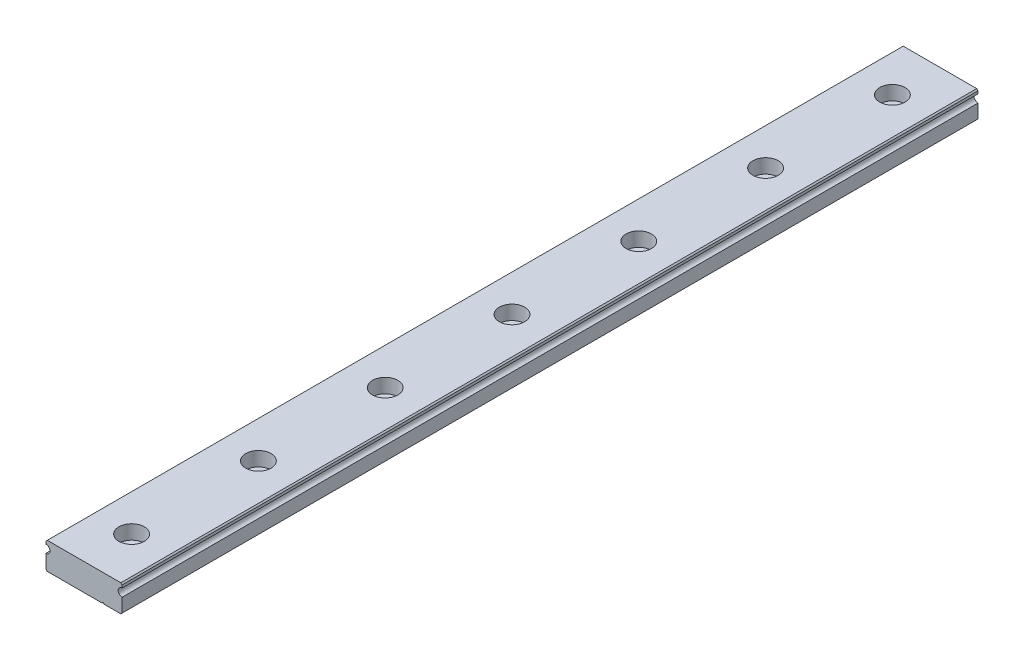
ISO-10303-21;
HEADER;
FILE_DESCRIPTION(('STEP AP214'),'2;1');
FILE_NAME('part.step','',(''),(''),'','','');
FILE_SCHEMA(('AUTOMOTIVE_DESIGN { 1 0 10303 214 1 1 1 1 }'));
ENDSEC;
DATA;
#1=APPLICATION_CONTEXT('core data for automotive mechanical design processes');
#2=APPLICATION_PROTOCOL_DEFINITION('international standard','automotive_design',2000,#1);
#3=PRODUCT_CONTEXT('',#1,'mechanical');
#4=PRODUCT('Part','Part','',(#3));
#5=PRODUCT_RELATED_PRODUCT_CATEGORY('part','',(#4));
#6=PRODUCT_DEFINITION_FORMATION('','',#4);
#7=PRODUCT_DEFINITION_CONTEXT('part definition',#1,'design');
#8=PRODUCT_DEFINITION('design','',#6,#7);
#9=PRODUCT_DEFINITION_SHAPE('','',#8);
#10=(LENGTH_UNIT() NAMED_UNIT(*) SI_UNIT(.MILLI.,.METRE.));
#11=(NAMED_UNIT(*) PLANE_ANGLE_UNIT() SI_UNIT($,.RADIAN.));
#12=(NAMED_UNIT(*) SI_UNIT($,.STERADIAN.) SOLID_ANGLE_UNIT());
#13=UNCERTAINTY_MEASURE_WITH_UNIT(LENGTH_MEASURE(1.E-05),#10,'distance_accuracy_value','');
#14=(GEOMETRIC_REPRESENTATION_CONTEXT(3) GLOBAL_UNCERTAINTY_ASSIGNED_CONTEXT((#13)) GLOBAL_UNIT_ASSIGNED_CONTEXT((#10,
#11,#12)) REPRESENTATION_CONTEXT('',''));
#15=CARTESIAN_POINT('',(0.,0.,0.));
#16=DIRECTION('',(0.,0.,1.));
#17=DIRECTION('',(1.,0.,0.));
#18=AXIS2_PLACEMENT_3D('',#15,#16,#17);
#19=CARTESIAN_POINT('',(-12.,1.75,-270.));
#20=DIRECTION('',(0.,0.,1.));
#21=DIRECTION('',(1.,0.,0.));
#22=AXIS2_PLACEMENT_3D('',#19,#20,#21);
#23=CYLINDRICAL_SURFACE('',#22,1.25);
#24=CARTESIAN_POINT('',(-12.,1.75,0.));
#25=DIRECTION('',(0.,0.,-1.));
#26=DIRECTION('',(1.,0.,0.));
#27=AXIS2_PLACEMENT_3D('',#24,#25,#26);
#28=CIRCLE('',#27,1.25);
#29=CARTESIAN_POINT('',(-12.,3.,0.));
#30=VERTEX_POINT('',#29);
#31=CARTESIAN_POINT('',(-12.,0.5,0.));
#32=VERTEX_POINT('',#31);
#33=EDGE_CURVE('E169',#30,#32,#28,.T.);
#34=ORIENTED_EDGE('',*,*,#33,.F.);
#35=DIRECTION('',(0.,0.,1.));
#36=VECTOR('',#35,1.);
#37=CARTESIAN_POINT('',(-12.,3.,-270.));
#38=LINE('',#37,#36);
#39=CARTESIAN_POINT('',(-12.,3.,-270.));
#40=VERTEX_POINT('',#39);
#41=EDGE_CURVE('E49',#40,#30,#38,.T.);
#42=ORIENTED_EDGE('',*,*,#41,.F.);
#43=CARTESIAN_POINT('',(-12.,1.75,-270.));
#44=DIRECTION('',(0.,0.,-1.));
#45=DIRECTION('',(1.,0.,0.));
#46=AXIS2_PLACEMENT_3D('',#43,#44,#45);
#47=CIRCLE('',#46,1.25);
#48=CARTESIAN_POINT('',(-12.,0.5,-270.));
#49=VERTEX_POINT('',#48);
#50=EDGE_CURVE('E209',#40,#49,#47,.T.);
#51=ORIENTED_EDGE('',*,*,#50,.T.);
#52=DIRECTION('',(0.,0.,1.));
#53=VECTOR('',#52,1.);
#54=CARTESIAN_POINT('',(-12.,0.5,-270.));
#55=LINE('',#54,#53);
#56=EDGE_CURVE('E108',#49,#32,#55,.T.);
#57=ORIENTED_EDGE('',*,*,#56,.T.);
#58=EDGE_LOOP('',(#34,#42,#51,#57));
#59=FACE_BOUND('',#58,.T.);
#60=ADVANCED_FACE('F32',(#59),#23,.F.);
#61=CARTESIAN_POINT('',(-12.,3.,-270.));
#62=DIRECTION('',(-1.,0.,0.));
#63=DIRECTION('',(0.,-1.,0.));
#64=AXIS2_PLACEMENT_3D('',#61,#62,#63);
#65=PLANE('',#64);
#66=DIRECTION('',(0.,-1.,0.));
#67=VECTOR('',#66,1.);
#68=CARTESIAN_POINT('',(-12.,3.,0.));
#69=LINE('',#68,#67);
#70=CARTESIAN_POINT('',(-12.,3.85,0.));
#71=VERTEX_POINT('',#70);
#72=EDGE_CURVE('E206',#71,#30,#69,.T.);
#73=ORIENTED_EDGE('',*,*,#72,.F.);
#74=DIRECTION('',(0.,0.,1.));
#75=VECTOR('',#74,1.);
#76=CARTESIAN_POINT('',(-12.,3.85,-270.));
#77=LINE('',#76,#75);
#78=CARTESIAN_POINT('',(-12.,3.85,-270.));
#79=VERTEX_POINT('',#78);
#80=EDGE_CURVE('E96',#79,#71,#77,.T.);
#81=ORIENTED_EDGE('',*,*,#80,.F.);
#82=DIRECTION('',(0.,-1.,0.));
#83=VECTOR('',#82,1.);
#84=CARTESIAN_POINT('',(-12.,3.,-270.));
#85=LINE('',#84,#83);
#86=EDGE_CURVE('E158',#79,#40,#85,.T.);
#87=ORIENTED_EDGE('',*,*,#86,.T.);
#88=ORIENTED_EDGE('',*,*,#41,.T.);
#89=EDGE_LOOP('',(#73,#81,#87,#88));
#90=FACE_BOUND('',#89,.T.);
#91=ADVANCED_FACE('F311',(#90),#65,.T.);
#92=CARTESIAN_POINT('',(-11.6,4.25,-270.));
#93=DIRECTION('',(-0.707106781186544,0.70710678118655,0.));
#94=DIRECTION('',(-0.707106781186551,-0.707106781186545,0.));
#95=AXIS2_PLACEMENT_3D('',#92,#93,#94);
#96=PLANE('',#95);
#97=DIRECTION('',(-0.707106781186551,-0.707106781186544,0.));
#98=VECTOR('',#97,1.);
#99=CARTESIAN_POINT('',(-11.6,4.25,0.));
#100=LINE('',#99,#98);
#101=CARTESIAN_POINT('',(-11.6,4.25,0.));
#102=VERTEX_POINT('',#101);
#103=EDGE_CURVE('E145',#102,#71,#100,.T.);
#104=ORIENTED_EDGE('',*,*,#103,.F.);
#105=DIRECTION('',(0.,0.,1.));
#106=VECTOR('',#105,1.);
#107=CARTESIAN_POINT('',(-11.6,4.25,-270.));
#108=LINE('',#107,#106);
#109=CARTESIAN_POINT('',(-11.6,4.25,-270.));
#110=VERTEX_POINT('',#109);
#111=EDGE_CURVE('E140',#110,#102,#108,.T.);
#112=ORIENTED_EDGE('',*,*,#111,.F.);
#113=DIRECTION('',(-0.707106781186551,-0.707106781186544,0.));
#114=VECTOR('',#113,1.);
#115=CARTESIAN_POINT('',(-11.6,4.25,-270.));
#116=LINE('',#115,#114);
#117=EDGE_CURVE('E143',#110,#79,#116,.T.);
#118=ORIENTED_EDGE('',*,*,#117,.T.);
#119=ORIENTED_EDGE('',*,*,#80,.T.);
#120=EDGE_LOOP('',(#104,#112,#118,#119));
#121=FACE_BOUND('',#120,.T.);
#122=ADVANCED_FACE('F142',(#121),#96,.T.);
#123=CARTESIAN_POINT('',(11.6,4.25,-270.));
#124=DIRECTION('',(0.,1.,0.));
#125=DIRECTION('',(0.,0.,1.));
#126=AXIS2_PLACEMENT_3D('',#123,#124,#125);
#127=PLANE('',#126);
#128=CARTESIAN_POINT('',(0.,4.25,-55.));
#129=DIRECTION('',(0.,1.,0.));
#130=DIRECTION('',(0.,0.,1.));
#131=AXIS2_PLACEMENT_3D('',#128,#129,#130);
#132=CIRCLE('',#131,4.);
#133=CARTESIAN_POINT('',(0.,4.25,-51.));
#134=VERTEX_POINT('',#133);
#135=EDGE_CURVE('E469',#134,#134,#132,.T.);
#136=ORIENTED_EDGE('',*,*,#135,.F.);
#137=EDGE_LOOP('',(#136));
#138=FACE_BOUND('',#137,.T.);
#139=CARTESIAN_POINT('',(0.,4.25,-15.));
#140=DIRECTION('',(0.,1.,0.));
#141=DIRECTION('',(0.,0.,1.));
#142=AXIS2_PLACEMENT_3D('',#139,#140,#141);
#143=CIRCLE('',#142,4.);
#144=CARTESIAN_POINT('',(0.,4.25,-11.));
#145=VERTEX_POINT('',#144);
#146=EDGE_CURVE('E458',#145,#145,#143,.T.);
#147=ORIENTED_EDGE('',*,*,#146,.F.);
#148=EDGE_LOOP('',(#147));
#149=FACE_BOUND('',#148,.T.);
#150=DIRECTION('',(-1.,0.,0.));
#151=VECTOR('',#150,1.);
#152=CARTESIAN_POINT('',(11.6,4.25,0.));
#153=LINE('',#152,#151);
#154=CARTESIAN_POINT('',(11.6,4.25,0.));
#155=VERTEX_POINT('',#154);
#156=EDGE_CURVE('E203',#155,#102,#153,.T.);
#157=ORIENTED_EDGE('',*,*,#156,.F.);
#158=DIRECTION('',(0.,0.,1.));
#159=VECTOR('',#158,1.);
#160=CARTESIAN_POINT('',(11.6,4.25,-270.));
#161=LINE('',#160,#159);
#162=CARTESIAN_POINT('',(11.6,4.25,-270.));
#163=VERTEX_POINT('',#162);
#164=EDGE_CURVE('E150',#163,#155,#161,.T.);
#165=ORIENTED_EDGE('',*,*,#164,.F.);
#166=DIRECTION('',(-1.,0.,0.));
#167=VECTOR('',#166,1.);
#168=CARTESIAN_POINT('',(11.6,4.25,-270.));
#169=LINE('',#168,#167);
#170=EDGE_CURVE('E156',#163,#110,#169,.T.);
#171=ORIENTED_EDGE('',*,*,#170,.T.);
#172=ORIENTED_EDGE('',*,*,#111,.T.);
#173=EDGE_LOOP('',(#157,#165,#171,#172));
#174=FACE_BOUND('',#173,.T.);
#175=CARTESIAN_POINT('',(0.,4.25,-95.));
#176=DIRECTION('',(0.,1.,0.));
#177=DIRECTION('',(0.,0.,1.));
#178=AXIS2_PLACEMENT_3D('',#175,#176,#177);
#179=CIRCLE('',#178,4.);
#180=CARTESIAN_POINT('',(0.,4.25,-91.));
#181=VERTEX_POINT('',#180);
#182=EDGE_CURVE('E211',#181,#181,#179,.T.);
#183=ORIENTED_EDGE('',*,*,#182,.F.);
#184=EDGE_LOOP('',(#183));
#185=FACE_BOUND('',#184,.T.);
#186=CARTESIAN_POINT('',(0.,4.25,-135.));
#187=DIRECTION('',(0.,1.,0.));
#188=DIRECTION('',(0.,0.,1.));
#189=AXIS2_PLACEMENT_3D('',#186,#187,#188);
#190=CIRCLE('',#189,4.);
#191=CARTESIAN_POINT('',(0.,4.25,-131.));
#192=VERTEX_POINT('',#191);
#193=EDGE_CURVE('E244',#192,#192,#190,.T.);
#194=ORIENTED_EDGE('',*,*,#193,.F.);
#195=EDGE_LOOP('',(#194));
#196=FACE_BOUND('',#195,.T.);
#197=CARTESIAN_POINT('',(0.,4.25,-175.));
#198=DIRECTION('',(0.,1.,0.));
#199=DIRECTION('',(0.,0.,1.));
#200=AXIS2_PLACEMENT_3D('',#197,#198,#199);
#201=CIRCLE('',#200,4.);
#202=CARTESIAN_POINT('',(0.,4.25,-171.));
#203=VERTEX_POINT('',#202);
#204=EDGE_CURVE('E256',#203,#203,#201,.T.);
#205=ORIENTED_EDGE('',*,*,#204,.F.);
#206=EDGE_LOOP('',(#205));
#207=FACE_BOUND('',#206,.T.);
#208=CARTESIAN_POINT('',(0.,4.25,-215.));
#209=DIRECTION('',(0.,1.,0.));
#210=DIRECTION('',(0.,0.,1.));
#211=AXIS2_PLACEMENT_3D('',#208,#209,#210);
#212=CIRCLE('',#211,4.);
#213=CARTESIAN_POINT('',(0.,4.25,-211.));
#214=VERTEX_POINT('',#213);
#215=EDGE_CURVE('E268',#214,#214,#212,.T.);
#216=ORIENTED_EDGE('',*,*,#215,.F.);
#217=EDGE_LOOP('',(#216));
#218=FACE_BOUND('',#217,.T.);
#219=CARTESIAN_POINT('',(0.,4.25,-255.));
#220=DIRECTION('',(0.,1.,0.));
#221=DIRECTION('',(0.,0.,1.));
#222=AXIS2_PLACEMENT_3D('',#219,#220,#221);
#223=CIRCLE('',#222,4.);
#224=CARTESIAN_POINT('',(0.,4.25,-251.));
#225=VERTEX_POINT('',#224);
#226=EDGE_CURVE('E280',#225,#225,#223,.T.);
#227=ORIENTED_EDGE('',*,*,#226,.F.);
#228=EDGE_LOOP('',(#227));
#229=FACE_BOUND('',#228,.T.);
#230=ADVANCED_FACE('F160',(#138,#149,#174,#185,#196,#207,#218,#229),#127,.T.);
#231=CARTESIAN_POINT('',(12.,3.85,-270.));
#232=DIRECTION('',(0.707106781186548,0.707106781186548,0.));
#233=DIRECTION('',(-0.707106781186548,0.707106781186548,0.));
#234=AXIS2_PLACEMENT_3D('',#231,#232,#233);
#235=PLANE('',#234);
#236=DIRECTION('',(-0.707106781186547,0.707106781186547,0.));
#237=VECTOR('',#236,1.);
#238=CARTESIAN_POINT('',(12.,3.85,0.));
#239=LINE('',#238,#237);
#240=CARTESIAN_POINT('',(12.,3.85,0.));
#241=VERTEX_POINT('',#240);
#242=EDGE_CURVE('E200',#241,#155,#239,.T.);
#243=ORIENTED_EDGE('',*,*,#242,.F.);
#244=DIRECTION('',(0.,0.,1.));
#245=VECTOR('',#244,1.);
#246=CARTESIAN_POINT('',(12.,3.85,-270.));
#247=LINE('',#246,#245);
#248=CARTESIAN_POINT('',(12.,3.85,-270.));
#249=VERTEX_POINT('',#248);
#250=EDGE_CURVE('E214',#249,#241,#247,.T.);
#251=ORIENTED_EDGE('',*,*,#250,.F.);
#252=DIRECTION('',(-0.707106781186547,0.707106781186547,0.));
#253=VECTOR('',#252,1.);
#254=CARTESIAN_POINT('',(12.,3.85,-270.));
#255=LINE('',#254,#253);
#256=EDGE_CURVE('E162',#249,#163,#255,.T.);
#257=ORIENTED_EDGE('',*,*,#256,.T.);
#258=ORIENTED_EDGE('',*,*,#164,.T.);
#259=EDGE_LOOP('',(#243,#251,#257,#258));
#260=FACE_BOUND('',#259,.T.);
#261=ADVANCED_FACE('F301',(#260),#235,.T.);
#262=CARTESIAN_POINT('',(12.,3.85,-270.));
#263=DIRECTION('',(1.,0.,0.));
#264=DIRECTION('',(0.,0.,-1.));
#265=AXIS2_PLACEMENT_3D('',#262,#263,#264);
#266=PLANE('',#265);
#267=DIRECTION('',(0.,1.,0.));
#268=VECTOR('',#267,1.);
#269=CARTESIAN_POINT('',(12.,3.85,0.));
#270=LINE('',#269,#268);
#271=CARTESIAN_POINT('',(12.,3.,0.));
#272=VERTEX_POINT('',#271);
#273=EDGE_CURVE('E197',#272,#241,#270,.T.);
#274=ORIENTED_EDGE('',*,*,#273,.F.);
#275=DIRECTION('',(0.,0.,1.));
#276=VECTOR('',#275,1.);
#277=CARTESIAN_POINT('',(12.,3.,-270.));
#278=LINE('',#277,#276);
#279=CARTESIAN_POINT('',(12.,3.,-270.));
#280=VERTEX_POINT('',#279);
#281=EDGE_CURVE('E216',#280,#272,#278,.T.);
#282=ORIENTED_EDGE('',*,*,#281,.F.);
#283=DIRECTION('',(0.,1.,0.));
#284=VECTOR('',#283,1.);
#285=CARTESIAN_POINT('',(12.,3.85,-270.));
#286=LINE('',#285,#284);
#287=EDGE_CURVE('E164',#280,#249,#286,.T.);
#288=ORIENTED_EDGE('',*,*,#287,.T.);
#289=ORIENTED_EDGE('',*,*,#250,.T.);
#290=EDGE_LOOP('',(#274,#282,#288,#289));
#291=FACE_BOUND('',#290,.T.);
#292=ADVANCED_FACE('F308',(#291),#266,.T.);
#293=CARTESIAN_POINT('',(12.,1.75,-270.));
#294=DIRECTION('',(0.,0.,1.));
#295=DIRECTION('',(1.,0.,0.));
#296=AXIS2_PLACEMENT_3D('',#293,#294,#295);
#297=CYLINDRICAL_SURFACE('',#296,1.25);
#298=CARTESIAN_POINT('',(12.,1.75,0.));
#299=DIRECTION('',(0.,0.,-1.));
#300=DIRECTION('',(1.,0.,0.));
#301=AXIS2_PLACEMENT_3D('',#298,#299,#300);
#302=CIRCLE('',#301,1.25);
#303=CARTESIAN_POINT('',(12.,0.5,0.));
#304=VERTEX_POINT('',#303);
#305=EDGE_CURVE('E194',#304,#272,#302,.T.);
#306=ORIENTED_EDGE('',*,*,#305,.F.);
#307=DIRECTION('',(0.,0.,1.));
#308=VECTOR('',#307,1.);
#309=CARTESIAN_POINT('',(12.,0.5,-270.));
#310=LINE('',#309,#308);
#311=CARTESIAN_POINT('',(12.,0.5,-270.));
#312=VERTEX_POINT('',#311);
#313=EDGE_CURVE('E218',#312,#304,#310,.T.);
#314=ORIENTED_EDGE('',*,*,#313,.F.);
#315=CARTESIAN_POINT('',(12.,1.75,-270.));
#316=DIRECTION('',(0.,0.,-1.));
#317=DIRECTION('',(1.,0.,0.));
#318=AXIS2_PLACEMENT_3D('',#315,#316,#317);
#319=CIRCLE('',#318,1.25);
#320=EDGE_CURVE('E425',#312,#280,#319,.T.);
#321=ORIENTED_EDGE('',*,*,#320,.T.);
#322=ORIENTED_EDGE('',*,*,#281,.T.);
#323=EDGE_LOOP('',(#306,#314,#321,#322));
#324=FACE_BOUND('',#323,.T.);
#325=ADVANCED_FACE('F406',(#324),#297,.F.);
#326=CARTESIAN_POINT('',(12.,0.5,-270.));
#327=DIRECTION('',(1.,0.,0.));
#328=DIRECTION('',(0.,0.,-1.));
#329=AXIS2_PLACEMENT_3D('',#326,#327,#328);
#330=PLANE('',#329);
#331=DIRECTION('',(0.,1.,0.));
#332=VECTOR('',#331,1.);
#333=CARTESIAN_POINT('',(12.,0.5,0.));
#334=LINE('',#333,#332);
#335=CARTESIAN_POINT('',(12.,-3.85,0.));
#336=VERTEX_POINT('',#335);
#337=EDGE_CURVE('E191',#336,#304,#334,.T.);
#338=ORIENTED_EDGE('',*,*,#337,.F.);
#339=DIRECTION('',(0.,0.,1.));
#340=VECTOR('',#339,1.);
#341=CARTESIAN_POINT('',(12.,-3.85,-270.));
#342=LINE('',#341,#340);
#343=CARTESIAN_POINT('',(12.,-3.85,-270.));
#344=VERTEX_POINT('',#343);
#345=EDGE_CURVE('E220',#344,#336,#342,.T.);
#346=ORIENTED_EDGE('',*,*,#345,.F.);
#347=DIRECTION('',(0.,1.,0.));
#348=VECTOR('',#347,1.);
#349=CARTESIAN_POINT('',(12.,0.5,-270.));
#350=LINE('',#349,#348);
#351=EDGE_CURVE('E428',#344,#312,#350,.T.);
#352=ORIENTED_EDGE('',*,*,#351,.T.);
#353=ORIENTED_EDGE('',*,*,#313,.T.);
#354=EDGE_LOOP('',(#338,#346,#352,#353));
#355=FACE_BOUND('',#354,.T.);
#356=ADVANCED_FACE('F402',(#355),#330,.T.);
#357=CARTESIAN_POINT('',(11.6,-4.25,-270.));
#358=DIRECTION('',(0.707106781186546,-0.707106781186549,0.));
#359=DIRECTION('',(0.707106781186549,0.707106781186546,0.));
#360=AXIS2_PLACEMENT_3D('',#357,#358,#359);
#361=PLANE('',#360);
#362=DIRECTION('',(0.707106781186549,0.707106781186546,0.));
#363=VECTOR('',#362,1.);
#364=CARTESIAN_POINT('',(11.6,-4.25,0.));
#365=LINE('',#364,#363);
#366=CARTESIAN_POINT('',(11.6,-4.25,0.));
#367=VERTEX_POINT('',#366);
#368=EDGE_CURVE('E188',#367,#336,#365,.T.);
#369=ORIENTED_EDGE('',*,*,#368,.F.);
#370=DIRECTION('',(0.,0.,1.));
#371=VECTOR('',#370,1.);
#372=CARTESIAN_POINT('',(11.6,-4.25,-270.));
#373=LINE('',#372,#371);
#374=CARTESIAN_POINT('',(11.6,-4.25,-270.));
#375=VERTEX_POINT('',#374);
#376=EDGE_CURVE('E222',#375,#367,#373,.T.);
#377=ORIENTED_EDGE('',*,*,#376,.F.);
#378=DIRECTION('',(0.707106781186549,0.707106781186546,0.));
#379=VECTOR('',#378,1.);
#380=CARTESIAN_POINT('',(11.6,-4.25,-270.));
#381=LINE('',#380,#379);
#382=EDGE_CURVE('E430',#375,#344,#381,.T.);
#383=ORIENTED_EDGE('',*,*,#382,.T.);
#384=ORIENTED_EDGE('',*,*,#345,.T.);
#385=EDGE_LOOP('',(#369,#377,#383,#384));
#386=FACE_BOUND('',#385,.T.);
#387=ADVANCED_FACE('F398',(#386),#361,.T.);
#388=CARTESIAN_POINT('',(11.6,-4.25,-270.));
#389=DIRECTION('',(0.,-1.,0.));
#390=DIRECTION('',(0.,0.,-1.));
#391=AXIS2_PLACEMENT_3D('',#388,#389,#390);
#392=PLANE('',#391);
#393=DIRECTION('',(1.,0.,0.));
#394=VECTOR('',#393,1.);
#395=CARTESIAN_POINT('',(11.6,-4.25,0.));
#396=LINE('',#395,#394);
#397=CARTESIAN_POINT('',(6.3,-4.25,0.));
#398=VERTEX_POINT('',#397);
#399=EDGE_CURVE('E185',#398,#367,#396,.T.);
#400=ORIENTED_EDGE('',*,*,#399,.F.);
#401=DIRECTION('',(0.,0.,1.));
#402=VECTOR('',#401,1.);
#403=CARTESIAN_POINT('',(6.3,-4.25,-270.));
#404=LINE('',#403,#402);
#405=CARTESIAN_POINT('',(6.3,-4.25,-270.));
#406=VERTEX_POINT('',#405);
#407=EDGE_CURVE('E224',#406,#398,#404,.T.);
#408=ORIENTED_EDGE('',*,*,#407,.F.);
#409=DIRECTION('',(1.,0.,0.));
#410=VECTOR('',#409,1.);
#411=CARTESIAN_POINT('',(11.6,-4.25,-270.));
#412=LINE('',#411,#410);
#413=EDGE_CURVE('E435',#406,#375,#412,.T.);
#414=ORIENTED_EDGE('',*,*,#413,.T.);
#415=ORIENTED_EDGE('',*,*,#376,.T.);
#416=EDGE_LOOP('',(#400,#408,#414,#415));
#417=FACE_BOUND('',#416,.T.);
#418=ADVANCED_FACE('F390',(#417),#392,.T.);
#419=CARTESIAN_POINT('',(6.,-4.25,-270.));
#420=DIRECTION('',(0.,0.,1.));
#421=DIRECTION('',(1.,0.,0.));
#422=AXIS2_PLACEMENT_3D('',#419,#420,#421);
#423=CYLINDRICAL_SURFACE('',#422,0.3);
#424=CARTESIAN_POINT('',(6.,-4.25,0.));
#425=DIRECTION('',(0.,0.,-1.));
#426=DIRECTION('',(1.,0.,0.));
#427=AXIS2_PLACEMENT_3D('',#424,#425,#426);
#428=CIRCLE('',#427,0.3);
#429=CARTESIAN_POINT('',(5.7,-4.25,0.));
#430=VERTEX_POINT('',#429);
#431=EDGE_CURVE('E182',#430,#398,#428,.T.);
#432=ORIENTED_EDGE('',*,*,#431,.F.);
#433=DIRECTION('',(0.,0.,1.));
#434=VECTOR('',#433,1.);
#435=CARTESIAN_POINT('',(5.7,-4.25,-270.));
#436=LINE('',#435,#434);
#437=CARTESIAN_POINT('',(5.7,-4.25,-270.));
#438=VERTEX_POINT('',#437);
#439=EDGE_CURVE('E226',#438,#430,#436,.T.);
#440=ORIENTED_EDGE('',*,*,#439,.F.);
#441=CARTESIAN_POINT('',(6.,-4.25,-270.));
#442=DIRECTION('',(0.,0.,-1.));
#443=DIRECTION('',(1.,0.,0.));
#444=AXIS2_PLACEMENT_3D('',#441,#442,#443);
#445=CIRCLE('',#444,0.3);
#446=EDGE_CURVE('E438',#438,#406,#445,.T.);
#447=ORIENTED_EDGE('',*,*,#446,.T.);
#448=ORIENTED_EDGE('',*,*,#407,.T.);
#449=EDGE_LOOP('',(#432,#440,#447,#448));
#450=FACE_BOUND('',#449,.T.);
#451=ADVANCED_FACE('F382',(#450),#423,.F.);
#452=CARTESIAN_POINT('',(5.7,-4.25,-270.));
#453=DIRECTION('',(0.,-1.,0.));
#454=DIRECTION('',(0.,0.,-1.));
#455=AXIS2_PLACEMENT_3D('',#452,#453,#454);
#456=PLANE('',#455);
#457=CARTESIAN_POINT('',(0.,-4.25,-55.));
#458=DIRECTION('',(0.,1.,0.));
#459=DIRECTION('',(0.,0.,1.));
#460=AXIS2_PLACEMENT_3D('',#457,#458,#459);
#461=CIRCLE('',#460,2.25);
#462=CARTESIAN_POINT('',(0.,-4.25,-52.75));
#463=VERTEX_POINT('',#462);
#464=EDGE_CURVE('E467',#463,#463,#461,.T.);
#465=ORIENTED_EDGE('',*,*,#464,.T.);
#466=EDGE_LOOP('',(#465));
#467=FACE_BOUND('',#466,.T.);
#468=CARTESIAN_POINT('',(0.,-4.25,-15.));
#469=DIRECTION('',(0.,1.,0.));
#470=DIRECTION('',(0.,0.,1.));
#471=AXIS2_PLACEMENT_3D('',#468,#469,#470);
#472=CIRCLE('',#471,2.25);
#473=CARTESIAN_POINT('',(0.,-4.25,-12.75));
#474=VERTEX_POINT('',#473);
#475=EDGE_CURVE('E173',#474,#474,#472,.T.);
#476=ORIENTED_EDGE('',*,*,#475,.T.);
#477=EDGE_LOOP('',(#476));
#478=FACE_BOUND('',#477,.T.);
#479=DIRECTION('',(1.,0.,0.));
#480=VECTOR('',#479,1.);
#481=CARTESIAN_POINT('',(5.7,-4.25,0.));
#482=LINE('',#481,#480);
#483=CARTESIAN_POINT('',(-11.6,-4.25,0.));
#484=VERTEX_POINT('',#483);
#485=EDGE_CURVE('E179',#484,#430,#482,.T.);
#486=ORIENTED_EDGE('',*,*,#485,.F.);
#487=DIRECTION('',(0.,0.,1.));
#488=VECTOR('',#487,1.);
#489=CARTESIAN_POINT('',(-11.6,-4.25,-270.));
#490=LINE('',#489,#488);
#491=CARTESIAN_POINT('',(-11.6,-4.25,-270.));
#492=VERTEX_POINT('',#491);
#493=EDGE_CURVE('E228',#492,#484,#490,.T.);
#494=ORIENTED_EDGE('',*,*,#493,.F.);
#495=DIRECTION('',(1.,0.,0.));
#496=VECTOR('',#495,1.);
#497=CARTESIAN_POINT('',(5.7,-4.25,-270.));
#498=LINE('',#497,#496);
#499=EDGE_CURVE('E441',#492,#438,#498,.T.);
#500=ORIENTED_EDGE('',*,*,#499,.T.);
#501=ORIENTED_EDGE('',*,*,#439,.T.);
#502=EDGE_LOOP('',(#486,#494,#500,#501));
#503=FACE_BOUND('',#502,.T.);
#504=CARTESIAN_POINT('',(0.,-4.25,-95.));
#505=DIRECTION('',(0.,1.,0.));
#506=DIRECTION('',(0.,0.,1.));
#507=AXIS2_PLACEMENT_3D('',#504,#505,#506);
#508=CIRCLE('',#507,2.25);
#509=CARTESIAN_POINT('',(0.,-4.25,-92.75));
#510=VERTEX_POINT('',#509);
#511=EDGE_CURVE('E235',#510,#510,#508,.T.);
#512=ORIENTED_EDGE('',*,*,#511,.T.);
#513=EDGE_LOOP('',(#512));
#514=FACE_BOUND('',#513,.T.);
#515=CARTESIAN_POINT('',(0.,-4.25,-135.));
#516=DIRECTION('',(0.,1.,0.));
#517=DIRECTION('',(0.,0.,1.));
#518=AXIS2_PLACEMENT_3D('',#515,#516,#517);
#519=CIRCLE('',#518,2.25);
#520=CARTESIAN_POINT('',(0.,-4.25,-132.75));
#521=VERTEX_POINT('',#520);
#522=EDGE_CURVE('E247',#521,#521,#519,.T.);
#523=ORIENTED_EDGE('',*,*,#522,.T.);
#524=EDGE_LOOP('',(#523));
#525=FACE_BOUND('',#524,.T.);
#526=CARTESIAN_POINT('',(0.,-4.25,-175.));
#527=DIRECTION('',(0.,1.,0.));
#528=DIRECTION('',(0.,0.,1.));
#529=AXIS2_PLACEMENT_3D('',#526,#527,#528);
#530=CIRCLE('',#529,2.25);
#531=CARTESIAN_POINT('',(0.,-4.25,-172.75));
#532=VERTEX_POINT('',#531);
#533=EDGE_CURVE('E259',#532,#532,#530,.T.);
#534=ORIENTED_EDGE('',*,*,#533,.T.);
#535=EDGE_LOOP('',(#534));
#536=FACE_BOUND('',#535,.T.);
#537=CARTESIAN_POINT('',(0.,-4.25,-215.));
#538=DIRECTION('',(0.,1.,0.));
#539=DIRECTION('',(0.,0.,1.));
#540=AXIS2_PLACEMENT_3D('',#537,#538,#539);
#541=CIRCLE('',#540,2.25);
#542=CARTESIAN_POINT('',(0.,-4.25,-212.75));
#543=VERTEX_POINT('',#542);
#544=EDGE_CURVE('E271',#543,#543,#541,.T.);
#545=ORIENTED_EDGE('',*,*,#544,.T.);
#546=EDGE_LOOP('',(#545));
#547=FACE_BOUND('',#546,.T.);
#548=CARTESIAN_POINT('',(0.,-4.25,-255.));
#549=DIRECTION('',(0.,1.,0.));
#550=DIRECTION('',(0.,0.,1.));
#551=AXIS2_PLACEMENT_3D('',#548,#549,#550);
#552=CIRCLE('',#551,2.25);
#553=CARTESIAN_POINT('',(0.,-4.25,-252.75));
#554=VERTEX_POINT('',#553);
#555=EDGE_CURVE('E283',#554,#554,#552,.T.);
#556=ORIENTED_EDGE('',*,*,#555,.T.);
#557=EDGE_LOOP('',(#556));
#558=FACE_BOUND('',#557,.T.);
#559=ADVANCED_FACE('F379',(#467,#478,#503,#514,#525,#536,#547,#558),#456,.T.);
#560=CARTESIAN_POINT('',(-12.,-3.85,-270.));
#561=DIRECTION('',(-0.707106781186548,-0.707106781186548,0.));
#562=DIRECTION('',(0.707106781186548,-0.707106781186548,0.));
#563=AXIS2_PLACEMENT_3D('',#560,#561,#562);
#564=PLANE('',#563);
#565=DIRECTION('',(0.707106781186547,-0.707106781186547,0.));
#566=VECTOR('',#565,1.);
#567=CARTESIAN_POINT('',(-12.,-3.85,0.));
#568=LINE('',#567,#566);
#569=CARTESIAN_POINT('',(-12.,-3.85,0.));
#570=VERTEX_POINT('',#569);
#571=EDGE_CURVE('E176',#570,#484,#568,.T.);
#572=ORIENTED_EDGE('',*,*,#571,.F.);
#573=DIRECTION('',(0.,0.,1.));
#574=VECTOR('',#573,1.);
#575=CARTESIAN_POINT('',(-12.,-3.85,-270.));
#576=LINE('',#575,#574);
#577=CARTESIAN_POINT('',(-12.,-3.85,-270.));
#578=VERTEX_POINT('',#577);
#579=EDGE_CURVE('E230',#578,#570,#576,.T.);
#580=ORIENTED_EDGE('',*,*,#579,.F.);
#581=DIRECTION('',(0.707106781186547,-0.707106781186547,0.));
#582=VECTOR('',#581,1.);
#583=CARTESIAN_POINT('',(-12.,-3.85,-270.));
#584=LINE('',#583,#582);
#585=EDGE_CURVE('E444',#578,#492,#584,.T.);
#586=ORIENTED_EDGE('',*,*,#585,.T.);
#587=ORIENTED_EDGE('',*,*,#493,.T.);
#588=EDGE_LOOP('',(#572,#580,#586,#587));
#589=FACE_BOUND('',#588,.T.);
#590=ADVANCED_FACE('F381',(#589),#564,.T.);
#591=CARTESIAN_POINT('',(-12.,-3.85,-270.));
#592=DIRECTION('',(-1.,0.,0.));
#593=DIRECTION('',(0.,0.,1.));
#594=AXIS2_PLACEMENT_3D('',#591,#592,#593);
#595=PLANE('',#594);
#596=DIRECTION('',(0.,-1.,0.));
#597=VECTOR('',#596,1.);
#598=CARTESIAN_POINT('',(-12.,-3.85,0.));
#599=LINE('',#598,#597);
#600=EDGE_CURVE('E172',#32,#570,#599,.T.);
#601=ORIENTED_EDGE('',*,*,#600,.F.);
#602=ORIENTED_EDGE('',*,*,#56,.F.);
#603=DIRECTION('',(0.,-1.,0.));
#604=VECTOR('',#603,1.);
#605=CARTESIAN_POINT('',(-12.,-3.85,-270.));
#606=LINE('',#605,#604);
#607=EDGE_CURVE('E447',#49,#578,#606,.T.);
#608=ORIENTED_EDGE('',*,*,#607,.T.);
#609=ORIENTED_EDGE('',*,*,#579,.T.);
#610=EDGE_LOOP('',(#601,#602,#608,#609));
#611=FACE_BOUND('',#610,.T.);
#612=ADVANCED_FACE('F323',(#611),#595,.T.);
#613=CARTESIAN_POINT('',(-12.,1.75,-270.));
#614=DIRECTION('',(0.,0.,1.));
#615=DIRECTION('',(1.,0.,0.));
#616=AXIS2_PLACEMENT_3D('',#613,#614,#615);
#617=PLANE('',#616);
#618=ORIENTED_EDGE('',*,*,#50,.F.);
#619=ORIENTED_EDGE('',*,*,#86,.F.);
#620=ORIENTED_EDGE('',*,*,#117,.F.);
#621=ORIENTED_EDGE('',*,*,#170,.F.);
#622=ORIENTED_EDGE('',*,*,#256,.F.);
#623=ORIENTED_EDGE('',*,*,#287,.F.);
#624=ORIENTED_EDGE('',*,*,#320,.F.);
#625=ORIENTED_EDGE('',*,*,#351,.F.);
#626=ORIENTED_EDGE('',*,*,#382,.F.);
#627=ORIENTED_EDGE('',*,*,#413,.F.);
#628=ORIENTED_EDGE('',*,*,#446,.F.);
#629=ORIENTED_EDGE('',*,*,#499,.F.);
#630=ORIENTED_EDGE('',*,*,#585,.F.);
#631=ORIENTED_EDGE('',*,*,#607,.F.);
#632=EDGE_LOOP('',(#618,#619,#620,#621,#622,#623,#624,#625,#626,#627,#628,#629,#630,#631));
#633=FACE_BOUND('',#632,.T.);
#634=ADVANCED_FACE('F154',(#633),#617,.F.);
#635=CARTESIAN_POINT('',(-12.,1.75,0.));
#636=DIRECTION('',(0.,0.,1.));
#637=DIRECTION('',(1.,0.,0.));
#638=AXIS2_PLACEMENT_3D('',#635,#636,#637);
#639=PLANE('',#638);
#640=ORIENTED_EDGE('',*,*,#33,.T.);
#641=ORIENTED_EDGE('',*,*,#600,.T.);
#642=ORIENTED_EDGE('',*,*,#571,.T.);
#643=ORIENTED_EDGE('',*,*,#485,.T.);
#644=ORIENTED_EDGE('',*,*,#431,.T.);
#645=ORIENTED_EDGE('',*,*,#399,.T.);
#646=ORIENTED_EDGE('',*,*,#368,.T.);
#647=ORIENTED_EDGE('',*,*,#337,.T.);
#648=ORIENTED_EDGE('',*,*,#305,.T.);
#649=ORIENTED_EDGE('',*,*,#273,.T.);
#650=ORIENTED_EDGE('',*,*,#242,.T.);
#651=ORIENTED_EDGE('',*,*,#156,.T.);
#652=ORIENTED_EDGE('',*,*,#103,.T.);
#653=ORIENTED_EDGE('',*,*,#72,.T.);
#654=EDGE_LOOP('',(#640,#641,#642,#643,#644,#645,#646,#647,#648,#649,#650,#651,#652,#653));
#655=FACE_BOUND('',#654,.T.);
#656=ADVANCED_FACE('F421',(#655),#639,.T.);
#657=CARTESIAN_POINT('',(0.,4.25,-15.));
#658=DIRECTION('',(0.,1.,0.));
#659=DIRECTION('',(0.,0.,1.));
#660=AXIS2_PLACEMENT_3D('',#657,#658,#659);
#661=CYLINDRICAL_SURFACE('',#660,2.25);
#662=ORIENTED_EDGE('',*,*,#475,.F.);
#663=EDGE_LOOP('',(#662));
#664=FACE_BOUND('',#663,.T.);
#665=CARTESIAN_POINT('',(0.,-0.25,-15.));
#666=DIRECTION('',(0.,1.,0.));
#667=DIRECTION('',(0.,0.,1.));
#668=AXIS2_PLACEMENT_3D('',#665,#666,#667);
#669=CIRCLE('',#668,2.25);
#670=CARTESIAN_POINT('',(0.,-0.25,-12.75));
#671=VERTEX_POINT('',#670);
#672=EDGE_CURVE('E452',#671,#671,#669,.T.);
#673=ORIENTED_EDGE('',*,*,#672,.T.);
#674=EDGE_LOOP('',(#673));
#675=FACE_BOUND('',#674,.T.);
#676=ADVANCED_FACE('F494',(#664,#675),#661,.F.);
#677=CARTESIAN_POINT('',(2.25000000000001,-0.25,-15.));
#678=DIRECTION('',(0.,-1.,0.));
#679=DIRECTION('',(0.,0.,-1.));
#680=AXIS2_PLACEMENT_3D('',#677,#678,#679);
#681=PLANE('',#680);
#682=ORIENTED_EDGE('',*,*,#672,.F.);
#683=EDGE_LOOP('',(#682));
#684=FACE_BOUND('',#683,.T.);
#685=CARTESIAN_POINT('',(0.,-0.25,-15.));
#686=DIRECTION('',(0.,1.,0.));
#687=DIRECTION('',(0.,0.,1.));
#688=AXIS2_PLACEMENT_3D('',#685,#686,#687);
#689=CIRCLE('',#688,4.);
#690=CARTESIAN_POINT('',(0.,-0.25,-11.));
#691=VERTEX_POINT('',#690);
#692=EDGE_CURVE('E455',#691,#691,#689,.T.);
#693=ORIENTED_EDGE('',*,*,#692,.T.);
#694=EDGE_LOOP('',(#693));
#695=FACE_BOUND('',#694,.T.);
#696=ADVANCED_FACE('F490',(#684,#695),#681,.F.);
#697=CARTESIAN_POINT('',(0.,4.25,-15.));
#698=DIRECTION('',(0.,1.,0.));
#699=DIRECTION('',(0.,0.,1.));
#700=AXIS2_PLACEMENT_3D('',#697,#698,#699);
#701=CYLINDRICAL_SURFACE('',#700,4.);
#702=ORIENTED_EDGE('',*,*,#692,.F.);
#703=EDGE_LOOP('',(#702));
#704=FACE_BOUND('',#703,.T.);
#705=ORIENTED_EDGE('',*,*,#146,.T.);
#706=EDGE_LOOP('',(#705));
#707=FACE_BOUND('',#706,.T.);
#708=ADVANCED_FACE('F486',(#704,#707),#701,.F.);
#709=CARTESIAN_POINT('',(0.,4.25,-55.));
#710=DIRECTION('',(0.,1.,0.));
#711=DIRECTION('',(0.,0.,1.));
#712=AXIS2_PLACEMENT_3D('',#709,#710,#711);
#713=CYLINDRICAL_SURFACE('',#712,2.25);
#714=ORIENTED_EDGE('',*,*,#464,.F.);
#715=EDGE_LOOP('',(#714));
#716=FACE_BOUND('',#715,.T.);
#717=CARTESIAN_POINT('',(0.,-0.25,-55.));
#718=DIRECTION('',(0.,1.,0.));
#719=DIRECTION('',(0.,0.,1.));
#720=AXIS2_PLACEMENT_3D('',#717,#718,#719);
#721=CIRCLE('',#720,2.25);
#722=CARTESIAN_POINT('',(0.,-0.25,-52.75));
#723=VERTEX_POINT('',#722);
#724=EDGE_CURVE('E461',#723,#723,#721,.T.);
#725=ORIENTED_EDGE('',*,*,#724,.T.);
#726=EDGE_LOOP('',(#725));
#727=FACE_BOUND('',#726,.T.);
#728=ADVANCED_FACE('F479',(#716,#727),#713,.F.);
#729=CARTESIAN_POINT('',(2.25000000000001,-0.25,-55.));
#730=DIRECTION('',(0.,-1.,0.));
#731=DIRECTION('',(0.,0.,-1.));
#732=AXIS2_PLACEMENT_3D('',#729,#730,#731);
#733=PLANE('',#732);
#734=ORIENTED_EDGE('',*,*,#724,.F.);
#735=EDGE_LOOP('',(#734));
#736=FACE_BOUND('',#735,.T.);
#737=CARTESIAN_POINT('',(0.,-0.25,-55.));
#738=DIRECTION('',(0.,1.,0.));
#739=DIRECTION('',(0.,0.,1.));
#740=AXIS2_PLACEMENT_3D('',#737,#738,#739);
#741=CIRCLE('',#740,4.);
#742=CARTESIAN_POINT('',(0.,-0.25,-51.));
#743=VERTEX_POINT('',#742);
#744=EDGE_CURVE('E464',#743,#743,#741,.T.);
#745=ORIENTED_EDGE('',*,*,#744,.T.);
#746=EDGE_LOOP('',(#745));
#747=FACE_BOUND('',#746,.T.);
#748=ADVANCED_FACE('F473',(#736,#747),#733,.F.);
#749=CARTESIAN_POINT('',(0.,4.25,-55.));
#750=DIRECTION('',(0.,1.,0.));
#751=DIRECTION('',(0.,0.,1.));
#752=AXIS2_PLACEMENT_3D('',#749,#750,#751);
#753=CYLINDRICAL_SURFACE('',#752,4.);
#754=ORIENTED_EDGE('',*,*,#744,.F.);
#755=EDGE_LOOP('',(#754));
#756=FACE_BOUND('',#755,.T.);
#757=ORIENTED_EDGE('',*,*,#135,.T.);
#758=EDGE_LOOP('',(#757));
#759=FACE_BOUND('',#758,.T.);
#760=ADVANCED_FACE('F337',(#756,#759),#753,.F.);
#761=CARTESIAN_POINT('',(0.,4.25,-95.));
#762=DIRECTION('',(0.,1.,0.));
#763=DIRECTION('',(0.,0.,1.));
#764=AXIS2_PLACEMENT_3D('',#761,#762,#763);
#765=CYLINDRICAL_SURFACE('',#764,4.);
#766=CARTESIAN_POINT('',(0.,-0.25,-95.));
#767=DIRECTION('',(0.,1.,0.));
#768=DIRECTION('',(0.,0.,1.));
#769=AXIS2_PLACEMENT_3D('',#766,#767,#768);
#770=CIRCLE('',#769,4.);
#771=CARTESIAN_POINT('',(0.,-0.25,-91.));
#772=VERTEX_POINT('',#771);
#773=EDGE_CURVE('E241',#772,#772,#770,.T.);
#774=ORIENTED_EDGE('',*,*,#773,.F.);
#775=EDGE_LOOP('',(#774));
#776=FACE_BOUND('',#775,.T.);
#777=ORIENTED_EDGE('',*,*,#182,.T.);
#778=EDGE_LOOP('',(#777));
#779=FACE_BOUND('',#778,.T.);
#780=ADVANCED_FACE('F333',(#776,#779),#765,.F.);
#781=CARTESIAN_POINT('',(2.25000000000001,-0.25,-95.));
#782=DIRECTION('',(0.,-1.,0.));
#783=DIRECTION('',(0.,0.,-1.));
#784=AXIS2_PLACEMENT_3D('',#781,#782,#783);
#785=PLANE('',#784);
#786=CARTESIAN_POINT('',(0.,-0.25,-95.));
#787=DIRECTION('',(0.,1.,0.));
#788=DIRECTION('',(0.,0.,1.));
#789=AXIS2_PLACEMENT_3D('',#786,#787,#788);
#790=CIRCLE('',#789,2.25);
#791=CARTESIAN_POINT('',(0.,-0.25,-92.75));
#792=VERTEX_POINT('',#791);
#793=EDGE_CURVE('E238',#792,#792,#790,.T.);
#794=ORIENTED_EDGE('',*,*,#793,.F.);
#795=EDGE_LOOP('',(#794));
#796=FACE_BOUND('',#795,.T.);
#797=ORIENTED_EDGE('',*,*,#773,.T.);
#798=EDGE_LOOP('',(#797));
#799=FACE_BOUND('',#798,.T.);
#800=ADVANCED_FACE('F329',(#796,#799),#785,.F.);
#801=CARTESIAN_POINT('',(0.,4.25,-95.));
#802=DIRECTION('',(0.,1.,0.));
#803=DIRECTION('',(0.,0.,1.));
#804=AXIS2_PLACEMENT_3D('',#801,#802,#803);
#805=CYLINDRICAL_SURFACE('',#804,2.25);
#806=ORIENTED_EDGE('',*,*,#511,.F.);
#807=EDGE_LOOP('',(#806));
#808=FACE_BOUND('',#807,.T.);
#809=ORIENTED_EDGE('',*,*,#793,.T.);
#810=EDGE_LOOP('',(#809));
#811=FACE_BOUND('',#810,.T.);
#812=ADVANCED_FACE('F325',(#808,#811),#805,.F.);
#813=CARTESIAN_POINT('',(0.,4.25,-135.));
#814=DIRECTION('',(0.,1.,0.));
#815=DIRECTION('',(0.,0.,1.));
#816=AXIS2_PLACEMENT_3D('',#813,#814,#815);
#817=CYLINDRICAL_SURFACE('',#816,4.);
#818=CARTESIAN_POINT('',(0.,-0.25,-135.));
#819=DIRECTION('',(0.,1.,0.));
#820=DIRECTION('',(0.,0.,1.));
#821=AXIS2_PLACEMENT_3D('',#818,#819,#820);
#822=CIRCLE('',#821,4.);
#823=CARTESIAN_POINT('',(0.,-0.25,-131.));
#824=VERTEX_POINT('',#823);
#825=EDGE_CURVE('E253',#824,#824,#822,.T.);
#826=ORIENTED_EDGE('',*,*,#825,.F.);
#827=EDGE_LOOP('',(#826));
#828=FACE_BOUND('',#827,.T.);
#829=ORIENTED_EDGE('',*,*,#193,.T.);
#830=EDGE_LOOP('',(#829));
#831=FACE_BOUND('',#830,.T.);
#832=ADVANCED_FACE('F328',(#828,#831),#817,.F.);
#833=CARTESIAN_POINT('',(2.25000000000001,-0.25,-135.));
#834=DIRECTION('',(0.,-1.,0.));
#835=DIRECTION('',(0.,0.,-1.));
#836=AXIS2_PLACEMENT_3D('',#833,#834,#835);
#837=PLANE('',#836);
#838=CARTESIAN_POINT('',(0.,-0.25,-135.));
#839=DIRECTION('',(0.,1.,0.));
#840=DIRECTION('',(0.,0.,1.));
#841=AXIS2_PLACEMENT_3D('',#838,#839,#840);
#842=CIRCLE('',#841,2.25);
#843=CARTESIAN_POINT('',(0.,-0.25,-132.75));
#844=VERTEX_POINT('',#843);
#845=EDGE_CURVE('E250',#844,#844,#842,.T.);
#846=ORIENTED_EDGE('',*,*,#845,.F.);
#847=EDGE_LOOP('',(#846));
#848=FACE_BOUND('',#847,.T.);
#849=ORIENTED_EDGE('',*,*,#825,.T.);
#850=EDGE_LOOP('',(#849));
#851=FACE_BOUND('',#850,.T.);
#852=ADVANCED_FACE('F343',(#848,#851),#837,.F.);
#853=CARTESIAN_POINT('',(0.,4.25,-135.));
#854=DIRECTION('',(0.,1.,0.));
#855=DIRECTION('',(0.,0.,1.));
#856=AXIS2_PLACEMENT_3D('',#853,#854,#855);
#857=CYLINDRICAL_SURFACE('',#856,2.25);
#858=ORIENTED_EDGE('',*,*,#522,.F.);
#859=EDGE_LOOP('',(#858));
#860=FACE_BOUND('',#859,.T.);
#861=ORIENTED_EDGE('',*,*,#845,.T.);
#862=EDGE_LOOP('',(#861));
#863=FACE_BOUND('',#862,.T.);
#864=ADVANCED_FACE('F339',(#860,#863),#857,.F.);
#865=CARTESIAN_POINT('',(0.,4.25,-175.));
#866=DIRECTION('',(0.,1.,0.));
#867=DIRECTION('',(0.,0.,1.));
#868=AXIS2_PLACEMENT_3D('',#865,#866,#867);
#869=CYLINDRICAL_SURFACE('',#868,4.);
#870=CARTESIAN_POINT('',(0.,-0.25,-175.));
#871=DIRECTION('',(0.,1.,0.));
#872=DIRECTION('',(0.,0.,1.));
#873=AXIS2_PLACEMENT_3D('',#870,#871,#872);
#874=CIRCLE('',#873,4.);
#875=CARTESIAN_POINT('',(0.,-0.25,-171.));
#876=VERTEX_POINT('',#875);
#877=EDGE_CURVE('E265',#876,#876,#874,.T.);
#878=ORIENTED_EDGE('',*,*,#877,.F.);
#879=EDGE_LOOP('',(#878));
#880=FACE_BOUND('',#879,.T.);
#881=ORIENTED_EDGE('',*,*,#204,.T.);
#882=EDGE_LOOP('',(#881));
#883=FACE_BOUND('',#882,.T.);
#884=ADVANCED_FACE('F342',(#880,#883),#869,.F.);
#885=CARTESIAN_POINT('',(2.25000000000001,-0.25,-175.));
#886=DIRECTION('',(0.,-1.,0.));
#887=DIRECTION('',(0.,0.,-1.));
#888=AXIS2_PLACEMENT_3D('',#885,#886,#887);
#889=PLANE('',#888);
#890=CARTESIAN_POINT('',(0.,-0.25,-175.));
#891=DIRECTION('',(0.,1.,0.));
#892=DIRECTION('',(0.,0.,1.));
#893=AXIS2_PLACEMENT_3D('',#890,#891,#892);
#894=CIRCLE('',#893,2.25);
#895=CARTESIAN_POINT('',(0.,-0.25,-172.75));
#896=VERTEX_POINT('',#895);
#897=EDGE_CURVE('E262',#896,#896,#894,.T.);
#898=ORIENTED_EDGE('',*,*,#897,.F.);
#899=EDGE_LOOP('',(#898));
#900=FACE_BOUND('',#899,.T.);
#901=ORIENTED_EDGE('',*,*,#877,.T.);
#902=EDGE_LOOP('',(#901));
#903=FACE_BOUND('',#902,.T.);
#904=ADVANCED_FACE('F355',(#900,#903),#889,.F.);
#905=CARTESIAN_POINT('',(0.,4.25,-175.));
#906=DIRECTION('',(0.,1.,0.));
#907=DIRECTION('',(0.,0.,1.));
#908=AXIS2_PLACEMENT_3D('',#905,#906,#907);
#909=CYLINDRICAL_SURFACE('',#908,2.25);
#910=ORIENTED_EDGE('',*,*,#533,.F.);
#911=EDGE_LOOP('',(#910));
#912=FACE_BOUND('',#911,.T.);
#913=ORIENTED_EDGE('',*,*,#897,.T.);
#914=EDGE_LOOP('',(#913));
#915=FACE_BOUND('',#914,.T.);
#916=ADVANCED_FACE('F351',(#912,#915),#909,.F.);
#917=CARTESIAN_POINT('',(0.,4.25,-215.));
#918=DIRECTION('',(0.,1.,0.));
#919=DIRECTION('',(0.,0.,1.));
#920=AXIS2_PLACEMENT_3D('',#917,#918,#919);
#921=CYLINDRICAL_SURFACE('',#920,4.);
#922=CARTESIAN_POINT('',(0.,-0.25,-215.));
#923=DIRECTION('',(0.,1.,0.));
#924=DIRECTION('',(0.,0.,1.));
#925=AXIS2_PLACEMENT_3D('',#922,#923,#924);
#926=CIRCLE('',#925,4.);
#927=CARTESIAN_POINT('',(0.,-0.25,-211.));
#928=VERTEX_POINT('',#927);
#929=EDGE_CURVE('E277',#928,#928,#926,.T.);
#930=ORIENTED_EDGE('',*,*,#929,.F.);
#931=EDGE_LOOP('',(#930));
#932=FACE_BOUND('',#931,.T.);
#933=ORIENTED_EDGE('',*,*,#215,.T.);
#934=EDGE_LOOP('',(#933));
#935=FACE_BOUND('',#934,.T.);
#936=ADVANCED_FACE('F354',(#932,#935),#921,.F.);
#937=CARTESIAN_POINT('',(2.25000000000001,-0.25,-215.));
#938=DIRECTION('',(0.,-1.,0.));
#939=DIRECTION('',(0.,0.,-1.));
#940=AXIS2_PLACEMENT_3D('',#937,#938,#939);
#941=PLANE('',#940);
#942=CARTESIAN_POINT('',(0.,-0.25,-215.));
#943=DIRECTION('',(0.,1.,0.));
#944=DIRECTION('',(0.,0.,1.));
#945=AXIS2_PLACEMENT_3D('',#942,#943,#944);
#946=CIRCLE('',#945,2.25);
#947=CARTESIAN_POINT('',(0.,-0.25,-212.75));
#948=VERTEX_POINT('',#947);
#949=EDGE_CURVE('E274',#948,#948,#946,.T.);
#950=ORIENTED_EDGE('',*,*,#949,.F.);
#951=EDGE_LOOP('',(#950));
#952=FACE_BOUND('',#951,.T.);
#953=ORIENTED_EDGE('',*,*,#929,.T.);
#954=EDGE_LOOP('',(#953));
#955=FACE_BOUND('',#954,.T.);
#956=ADVANCED_FACE('F365',(#952,#955),#941,.F.);
#957=CARTESIAN_POINT('',(0.,4.25,-215.));
#958=DIRECTION('',(0.,1.,0.));
#959=DIRECTION('',(0.,0.,1.));
#960=AXIS2_PLACEMENT_3D('',#957,#958,#959);
#961=CYLINDRICAL_SURFACE('',#960,2.25);
#962=ORIENTED_EDGE('',*,*,#544,.F.);
#963=EDGE_LOOP('',(#962));
#964=FACE_BOUND('',#963,.T.);
#965=ORIENTED_EDGE('',*,*,#949,.T.);
#966=EDGE_LOOP('',(#965));
#967=FACE_BOUND('',#966,.T.);
#968=ADVANCED_FACE('F297',(#964,#967),#961,.F.);
#969=CARTESIAN_POINT('',(0.,4.25,-255.));
#970=DIRECTION('',(0.,1.,0.));
#971=DIRECTION('',(0.,0.,1.));
#972=AXIS2_PLACEMENT_3D('',#969,#970,#971);
#973=CYLINDRICAL_SURFACE('',#972,4.);
#974=CARTESIAN_POINT('',(0.,-0.25,-255.));
#975=DIRECTION('',(0.,1.,0.));
#976=DIRECTION('',(0.,0.,1.));
#977=AXIS2_PLACEMENT_3D('',#974,#975,#976);
#978=CIRCLE('',#977,4.);
#979=CARTESIAN_POINT('',(0.,-0.25,-251.));
#980=VERTEX_POINT('',#979);
#981=EDGE_CURVE('E11',#980,#980,#978,.T.);
#982=ORIENTED_EDGE('',*,*,#981,.F.);
#983=EDGE_LOOP('',(#982));
#984=FACE_BOUND('',#983,.T.);
#985=ORIENTED_EDGE('',*,*,#226,.T.);
#986=EDGE_LOOP('',(#985));
#987=FACE_BOUND('',#986,.T.);
#988=ADVANCED_FACE('F34',(#984,#987),#973,.F.);
#989=CARTESIAN_POINT('',(2.25000000000001,-0.25,-255.));
#990=DIRECTION('',(0.,-1.,0.));
#991=DIRECTION('',(0.,0.,-1.));
#992=AXIS2_PLACEMENT_3D('',#989,#990,#991);
#993=PLANE('',#992);
#994=CARTESIAN_POINT('',(0.,-0.25,-255.));
#995=DIRECTION('',(0.,1.,0.));
#996=DIRECTION('',(0.,0.,1.));
#997=AXIS2_PLACEMENT_3D('',#994,#995,#996);
#998=CIRCLE('',#997,2.25);
#999=CARTESIAN_POINT('',(0.,-0.25,-252.75));
#1000=VERTEX_POINT('',#999);
#1001=EDGE_CURVE('E41',#1000,#1000,#998,.T.);
#1002=ORIENTED_EDGE('',*,*,#1001,.F.);
#1003=EDGE_LOOP('',(#1002));
#1004=FACE_BOUND('',#1003,.T.);
#1005=ORIENTED_EDGE('',*,*,#981,.T.);
#1006=EDGE_LOOP('',(#1005));
#1007=FACE_BOUND('',#1006,.T.);
#1008=ADVANCED_FACE('F290',(#1004,#1007),#993,.F.);
#1009=CARTESIAN_POINT('',(0.,4.25,-255.));
#1010=DIRECTION('',(0.,1.,0.));
#1011=DIRECTION('',(0.,0.,1.));
#1012=AXIS2_PLACEMENT_3D('',#1009,#1010,#1011);
#1013=CYLINDRICAL_SURFACE('',#1012,2.25);
#1014=ORIENTED_EDGE('',*,*,#555,.F.);
#1015=EDGE_LOOP('',(#1014));
#1016=FACE_BOUND('',#1015,.T.);
#1017=ORIENTED_EDGE('',*,*,#1001,.T.);
#1018=EDGE_LOOP('',(#1017));
#1019=FACE_BOUND('',#1018,.T.);
#1020=ADVANCED_FACE('F288',(#1016,#1019),#1013,.F.);
#1021=CLOSED_SHELL('',(#60,#91,#122,#230,#261,#292,#325,#356,#387,#418,#451,#559,#590,#612,#634,
#656,#676,#696,#708,#728,#748,#760,#780,#800,#812,#832,#852,#864,#884,#904,#916,#936,#956,#968,
#988,#1008,#1020));
#1022=MANIFOLD_SOLID_BREP('B2',#1021);
#1023=ADVANCED_BREP_SHAPE_REPRESENTATION('',(#18,#1022),#14);
#1024=SHAPE_DEFINITION_REPRESENTATION(#9,#1023);
ENDSEC;
END-ISO-10303-21;
